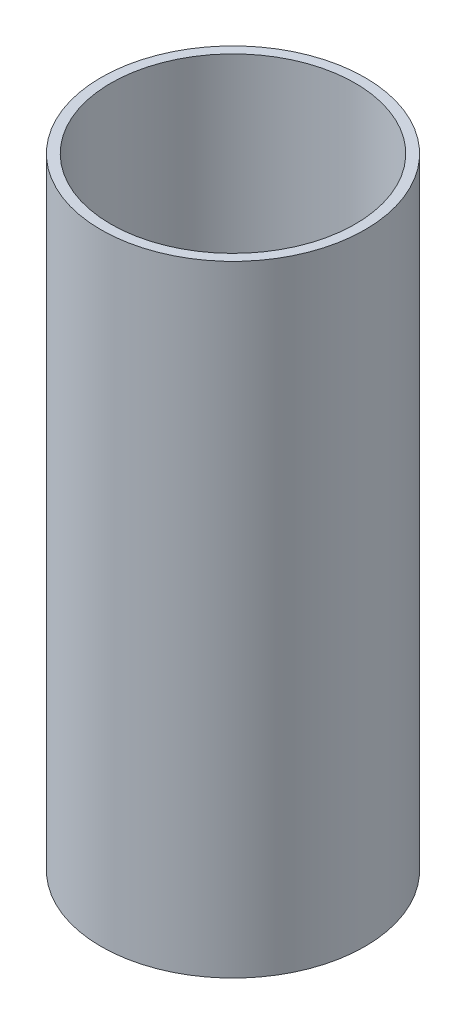
ISO-10303-21;
HEADER;
FILE_DESCRIPTION(('STEP AP214'),'2;1');
FILE_NAME('part.step','',(''),(''),'','','');
FILE_SCHEMA(('AUTOMOTIVE_DESIGN { 1 0 10303 214 1 1 1 1 }'));
ENDSEC;
DATA;
#1=APPLICATION_CONTEXT('core data for automotive mechanical design processes');
#2=APPLICATION_PROTOCOL_DEFINITION('international standard','automotive_design',2000,#1);
#3=PRODUCT_CONTEXT('',#1,'mechanical');
#4=PRODUCT('Part','Part','',(#3));
#5=PRODUCT_RELATED_PRODUCT_CATEGORY('part','',(#4));
#6=PRODUCT_DEFINITION_FORMATION('','',#4);
#7=PRODUCT_DEFINITION_CONTEXT('part definition',#1,'design');
#8=PRODUCT_DEFINITION('design','',#6,#7);
#9=PRODUCT_DEFINITION_SHAPE('','',#8);
#10=(LENGTH_UNIT() NAMED_UNIT(*) SI_UNIT(.MILLI.,.METRE.));
#11=(NAMED_UNIT(*) PLANE_ANGLE_UNIT() SI_UNIT($,.RADIAN.));
#12=(NAMED_UNIT(*) SI_UNIT($,.STERADIAN.) SOLID_ANGLE_UNIT());
#13=UNCERTAINTY_MEASURE_WITH_UNIT(LENGTH_MEASURE(1.E-05),#10,'distance_accuracy_value','');
#14=(GEOMETRIC_REPRESENTATION_CONTEXT(3) GLOBAL_UNCERTAINTY_ASSIGNED_CONTEXT((#13)) GLOBAL_UNIT_ASSIGNED_CONTEXT((#10,
#11,#12)) REPRESENTATION_CONTEXT('',''));
#15=CARTESIAN_POINT('',(0.,0.,0.));
#16=DIRECTION('',(0.,0.,1.));
#17=DIRECTION('',(1.,0.,0.));
#18=AXIS2_PLACEMENT_3D('',#15,#16,#17);
#19=CARTESIAN_POINT('',(0.,254.,0.));
#20=DIRECTION('',(0.,1.,0.));
#21=DIRECTION('',(0.,0.,1.));
#22=AXIS2_PLACEMENT_3D('',#19,#20,#21);
#23=PLANE('',#22);
#24=CARTESIAN_POINT('',(0.,254.,0.));
#25=DIRECTION('',(0.,1.,0.));
#26=DIRECTION('',(0.,0.,1.));
#27=AXIS2_PLACEMENT_3D('',#24,#25,#26);
#28=CIRCLE('',#27,54.);
#29=CARTESIAN_POINT('',(0.,254.,54.));
#30=VERTEX_POINT('',#29);
#31=EDGE_CURVE('E10',#30,#30,#28,.T.);
#32=ORIENTED_EDGE('',*,*,#31,.T.);
#33=EDGE_LOOP('',(#32));
#34=FACE_BOUND('',#33,.T.);
#35=CARTESIAN_POINT('',(0.,254.,0.));
#36=DIRECTION('',(0.,1.,0.));
#37=DIRECTION('',(0.,0.,1.));
#38=AXIS2_PLACEMENT_3D('',#35,#36,#37);
#39=CIRCLE('',#38,50.);
#40=CARTESIAN_POINT('',(0.,254.,50.));
#41=VERTEX_POINT('',#40);
#42=EDGE_CURVE('E42',#41,#41,#39,.T.);
#43=ORIENTED_EDGE('',*,*,#42,.F.);
#44=EDGE_LOOP('',(#43));
#45=FACE_BOUND('',#44,.T.);
#46=ADVANCED_FACE('F31',(#34,#45),#23,.T.);
#47=CARTESIAN_POINT('',(0.,0.,0.));
#48=DIRECTION('',(0.,1.,0.));
#49=DIRECTION('',(0.,0.,1.));
#50=AXIS2_PLACEMENT_3D('',#47,#48,#49);
#51=PLANE('',#50);
#52=CARTESIAN_POINT('',(0.,0.,0.));
#53=DIRECTION('',(0.,1.,0.));
#54=DIRECTION('',(0.,0.,1.));
#55=AXIS2_PLACEMENT_3D('',#52,#53,#54);
#56=CIRCLE('',#55,54.);
#57=CARTESIAN_POINT('',(0.,0.,54.));
#58=VERTEX_POINT('',#57);
#59=EDGE_CURVE('E35',#58,#58,#56,.T.);
#60=ORIENTED_EDGE('',*,*,#59,.F.);
#61=EDGE_LOOP('',(#60));
#62=FACE_BOUND('',#61,.T.);
#63=CARTESIAN_POINT('',(0.,0.,0.));
#64=DIRECTION('',(0.,1.,0.));
#65=DIRECTION('',(0.,0.,1.));
#66=AXIS2_PLACEMENT_3D('',#63,#64,#65);
#67=CIRCLE('',#66,50.);
#68=CARTESIAN_POINT('',(0.,0.,50.));
#69=VERTEX_POINT('',#68);
#70=EDGE_CURVE('E44',#69,#69,#67,.T.);
#71=ORIENTED_EDGE('',*,*,#70,.T.);
#72=EDGE_LOOP('',(#71));
#73=FACE_BOUND('',#72,.T.);
#74=ADVANCED_FACE('F54',(#62,#73),#51,.F.);
#75=CARTESIAN_POINT('',(0.,254.,0.));
#76=DIRECTION('',(0.,-1.,0.));
#77=DIRECTION('',(0.,0.,-1.));
#78=AXIS2_PLACEMENT_3D('',#75,#76,#77);
#79=CYLINDRICAL_SURFACE('',#78,54.);
#80=ORIENTED_EDGE('',*,*,#31,.F.);
#81=EDGE_LOOP('',(#80));
#82=FACE_BOUND('',#81,.T.);
#83=ORIENTED_EDGE('',*,*,#59,.T.);
#84=EDGE_LOOP('',(#83));
#85=FACE_BOUND('',#84,.T.);
#86=ADVANCED_FACE('F33',(#82,#85),#79,.T.);
#87=CARTESIAN_POINT('',(0.,254.,0.));
#88=DIRECTION('',(0.,-1.,0.));
#89=DIRECTION('',(0.,0.,-1.));
#90=AXIS2_PLACEMENT_3D('',#87,#88,#89);
#91=CYLINDRICAL_SURFACE('',#90,50.);
#92=ORIENTED_EDGE('',*,*,#42,.T.);
#93=EDGE_LOOP('',(#92));
#94=FACE_BOUND('',#93,.T.);
#95=ORIENTED_EDGE('',*,*,#70,.F.);
#96=EDGE_LOOP('',(#95));
#97=FACE_BOUND('',#96,.T.);
#98=ADVANCED_FACE('F50',(#94,#97),#91,.F.);
#99=CLOSED_SHELL('',(#46,#74,#86,#98));
#100=MANIFOLD_SOLID_BREP('B2',#99);
#101=ADVANCED_BREP_SHAPE_REPRESENTATION('',(#18,#100),#14);
#102=SHAPE_DEFINITION_REPRESENTATION(#9,#101);
ENDSEC;
END-ISO-10303-21;
